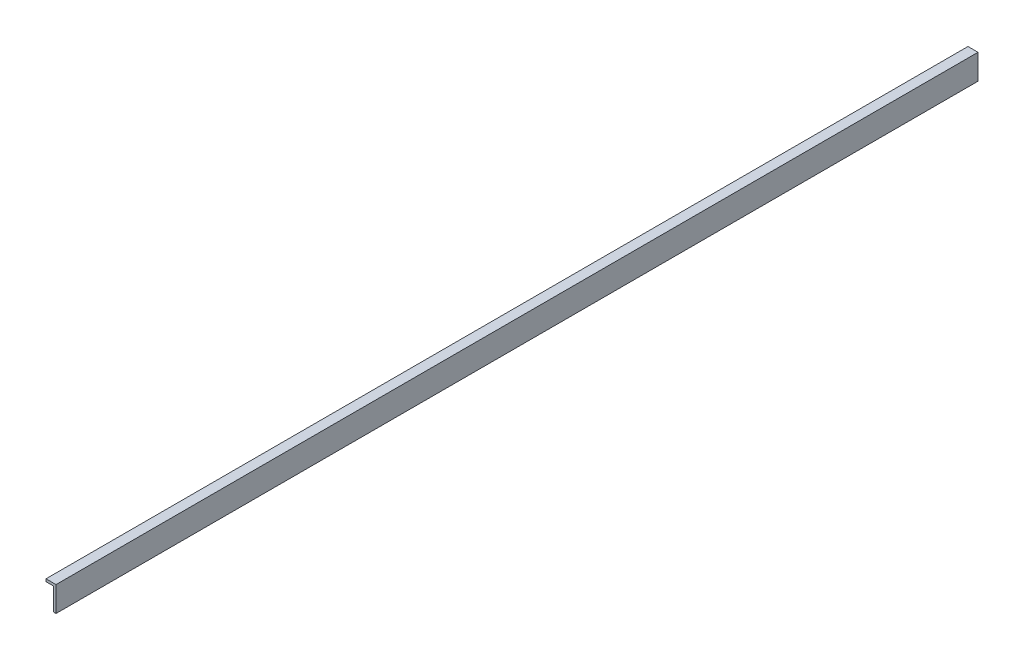
ISO-10303-21;
HEADER;
FILE_DESCRIPTION(('STEP AP214'),'2;1');
FILE_NAME('part.step','',(''),(''),'','','');
FILE_SCHEMA(('AUTOMOTIVE_DESIGN { 1 0 10303 214 1 1 1 1 }'));
ENDSEC;
DATA;
#1=APPLICATION_CONTEXT('core data for automotive mechanical design processes');
#2=APPLICATION_PROTOCOL_DEFINITION('international standard','automotive_design',2000,#1);
#3=PRODUCT_CONTEXT('',#1,'mechanical');
#4=PRODUCT('Part','Part','',(#3));
#5=PRODUCT_RELATED_PRODUCT_CATEGORY('part','',(#4));
#6=PRODUCT_DEFINITION_FORMATION('','',#4);
#7=PRODUCT_DEFINITION_CONTEXT('part definition',#1,'design');
#8=PRODUCT_DEFINITION('design','',#6,#7);
#9=PRODUCT_DEFINITION_SHAPE('','',#8);
#10=(LENGTH_UNIT() NAMED_UNIT(*) SI_UNIT(.MILLI.,.METRE.));
#11=(NAMED_UNIT(*) PLANE_ANGLE_UNIT() SI_UNIT($,.RADIAN.));
#12=(NAMED_UNIT(*) SI_UNIT($,.STERADIAN.) SOLID_ANGLE_UNIT());
#13=UNCERTAINTY_MEASURE_WITH_UNIT(LENGTH_MEASURE(1.E-05),#10,'distance_accuracy_value','');
#14=(GEOMETRIC_REPRESENTATION_CONTEXT(3) GLOBAL_UNCERTAINTY_ASSIGNED_CONTEXT((#13)) GLOBAL_UNIT_ASSIGNED_CONTEXT((#10,
#11,#12)) REPRESENTATION_CONTEXT('',''));
#15=CARTESIAN_POINT('',(0.,0.,0.));
#16=DIRECTION('',(0.,0.,1.));
#17=DIRECTION('',(1.,0.,0.));
#18=AXIS2_PLACEMENT_3D('',#15,#16,#17);
#19=CARTESIAN_POINT('',(501.5,422.5,-755.5));
#20=DIRECTION('',(-1.,0.,0.));
#21=DIRECTION('',(0.,0.,1.));
#22=AXIS2_PLACEMENT_3D('',#19,#20,#21);
#23=PLANE('',#22);
#24=DIRECTION('',(0.,-1.,0.));
#25=VECTOR('',#24,1.);
#26=CARTESIAN_POINT('',(501.5,422.5,-20.));
#27=LINE('',#26,#25);
#28=CARTESIAN_POINT('',(501.5,422.5,-20.));
#29=VERTEX_POINT('',#28);
#30=CARTESIAN_POINT('',(501.5,404.5,-20.));
#31=VERTEX_POINT('',#30);
#32=EDGE_CURVE('E124',#29,#31,#27,.T.);
#33=ORIENTED_EDGE('',*,*,#32,.F.);
#34=DIRECTION('',(0.,0.,1.));
#35=VECTOR('',#34,1.);
#36=CARTESIAN_POINT('',(501.5,422.5,-755.5));
#37=LINE('',#36,#35);
#38=CARTESIAN_POINT('',(501.5,422.5,-755.5));
#39=VERTEX_POINT('',#38);
#40=EDGE_CURVE('E11',#39,#29,#37,.T.);
#41=ORIENTED_EDGE('',*,*,#40,.F.);
#42=DIRECTION('',(0.,-1.,0.));
#43=VECTOR('',#42,1.);
#44=CARTESIAN_POINT('',(501.5,422.5,-755.5));
#45=LINE('',#44,#43);
#46=CARTESIAN_POINT('',(501.5,404.5,-755.5));
#47=VERTEX_POINT('',#46);
#48=EDGE_CURVE('E138',#39,#47,#45,.T.);
#49=ORIENTED_EDGE('',*,*,#48,.T.);
#50=DIRECTION('',(0.,0.,1.));
#51=VECTOR('',#50,1.);
#52=CARTESIAN_POINT('',(501.5,404.5,-755.5));
#53=LINE('',#52,#51);
#54=EDGE_CURVE('E42',#47,#31,#53,.T.);
#55=ORIENTED_EDGE('',*,*,#54,.T.);
#56=EDGE_LOOP('',(#33,#41,#49,#55));
#57=FACE_BOUND('',#56,.T.);
#58=ADVANCED_FACE('F39',(#57),#23,.T.);
#59=CARTESIAN_POINT('',(495.5,422.5,-755.5));
#60=DIRECTION('',(0.,-1.,0.));
#61=DIRECTION('',(0.,0.,-1.));
#62=AXIS2_PLACEMENT_3D('',#59,#60,#61);
#63=PLANE('',#62);
#64=DIRECTION('',(1.,0.,0.));
#65=VECTOR('',#64,1.);
#66=CARTESIAN_POINT('',(495.5,422.5,-20.));
#67=LINE('',#66,#65);
#68=CARTESIAN_POINT('',(495.5,422.5,-20.));
#69=VERTEX_POINT('',#68);
#70=EDGE_CURVE('E136',#69,#29,#67,.T.);
#71=ORIENTED_EDGE('',*,*,#70,.F.);
#72=DIRECTION('',(0.,0.,1.));
#73=VECTOR('',#72,1.);
#74=CARTESIAN_POINT('',(495.5,422.5,-755.5));
#75=LINE('',#74,#73);
#76=CARTESIAN_POINT('',(495.5,422.5,-755.5));
#77=VERTEX_POINT('',#76);
#78=EDGE_CURVE('E48',#77,#69,#75,.T.);
#79=ORIENTED_EDGE('',*,*,#78,.F.);
#80=DIRECTION('',(1.,0.,0.));
#81=VECTOR('',#80,1.);
#82=CARTESIAN_POINT('',(495.5,422.5,-755.5));
#83=LINE('',#82,#81);
#84=EDGE_CURVE('E114',#77,#39,#83,.T.);
#85=ORIENTED_EDGE('',*,*,#84,.T.);
#86=ORIENTED_EDGE('',*,*,#40,.T.);
#87=EDGE_LOOP('',(#71,#79,#85,#86));
#88=FACE_BOUND('',#87,.T.);
#89=ADVANCED_FACE('F146',(#88),#63,.T.);
#90=CARTESIAN_POINT('',(495.5,424.5,-755.5));
#91=DIRECTION('',(-1.,0.,0.));
#92=DIRECTION('',(0.,0.,1.));
#93=AXIS2_PLACEMENT_3D('',#90,#91,#92);
#94=PLANE('',#93);
#95=DIRECTION('',(0.,-1.,0.));
#96=VECTOR('',#95,1.);
#97=CARTESIAN_POINT('',(495.5,424.5,-20.));
#98=LINE('',#97,#96);
#99=CARTESIAN_POINT('',(495.5,424.5,-20.));
#100=VERTEX_POINT('',#99);
#101=EDGE_CURVE('E101',#100,#69,#98,.T.);
#102=ORIENTED_EDGE('',*,*,#101,.F.);
#103=DIRECTION('',(0.,0.,1.));
#104=VECTOR('',#103,1.);
#105=CARTESIAN_POINT('',(495.5,424.5,-755.5));
#106=LINE('',#105,#104);
#107=CARTESIAN_POINT('',(495.5,424.5,-755.5));
#108=VERTEX_POINT('',#107);
#109=EDGE_CURVE('E96',#108,#100,#106,.T.);
#110=ORIENTED_EDGE('',*,*,#109,.F.);
#111=DIRECTION('',(0.,-1.,0.));
#112=VECTOR('',#111,1.);
#113=CARTESIAN_POINT('',(495.5,424.5,-755.5));
#114=LINE('',#113,#112);
#115=EDGE_CURVE('E99',#108,#77,#114,.T.);
#116=ORIENTED_EDGE('',*,*,#115,.T.);
#117=ORIENTED_EDGE('',*,*,#78,.T.);
#118=EDGE_LOOP('',(#102,#110,#116,#117));
#119=FACE_BOUND('',#118,.T.);
#120=ADVANCED_FACE('F98',(#119),#94,.T.);
#121=CARTESIAN_POINT('',(503.5,424.5,-755.5));
#122=DIRECTION('',(0.,1.,0.));
#123=DIRECTION('',(0.,0.,1.));
#124=AXIS2_PLACEMENT_3D('',#121,#122,#123);
#125=PLANE('',#124);
#126=DIRECTION('',(-1.,0.,0.));
#127=VECTOR('',#126,1.);
#128=CARTESIAN_POINT('',(503.5,424.5,-20.));
#129=LINE('',#128,#127);
#130=CARTESIAN_POINT('',(503.5,424.5,-20.));
#131=VERTEX_POINT('',#130);
#132=EDGE_CURVE('E133',#131,#100,#129,.T.);
#133=ORIENTED_EDGE('',*,*,#132,.F.);
#134=DIRECTION('',(0.,0.,1.));
#135=VECTOR('',#134,1.);
#136=CARTESIAN_POINT('',(503.5,424.5,-755.5));
#137=LINE('',#136,#135);
#138=CARTESIAN_POINT('',(503.5,424.5,-755.5));
#139=VERTEX_POINT('',#138);
#140=EDGE_CURVE('E106',#139,#131,#137,.T.);
#141=ORIENTED_EDGE('',*,*,#140,.F.);
#142=DIRECTION('',(-1.,0.,0.));
#143=VECTOR('',#142,1.);
#144=CARTESIAN_POINT('',(503.5,424.5,-755.5));
#145=LINE('',#144,#143);
#146=EDGE_CURVE('E112',#139,#108,#145,.T.);
#147=ORIENTED_EDGE('',*,*,#146,.T.);
#148=ORIENTED_EDGE('',*,*,#109,.T.);
#149=EDGE_LOOP('',(#133,#141,#147,#148));
#150=FACE_BOUND('',#149,.T.);
#151=ADVANCED_FACE('F116',(#150),#125,.T.);
#152=CARTESIAN_POINT('',(503.5,404.5,-755.5));
#153=DIRECTION('',(1.,0.,0.));
#154=DIRECTION('',(0.,0.,-1.));
#155=AXIS2_PLACEMENT_3D('',#152,#153,#154);
#156=PLANE('',#155);
#157=DIRECTION('',(0.,1.,0.));
#158=VECTOR('',#157,1.);
#159=CARTESIAN_POINT('',(503.5,404.5,-20.));
#160=LINE('',#159,#158);
#161=CARTESIAN_POINT('',(503.5,404.5,-20.));
#162=VERTEX_POINT('',#161);
#163=EDGE_CURVE('E130',#162,#131,#160,.T.);
#164=ORIENTED_EDGE('',*,*,#163,.F.);
#165=DIRECTION('',(0.,0.,1.));
#166=VECTOR('',#165,1.);
#167=CARTESIAN_POINT('',(503.5,404.5,-755.5));
#168=LINE('',#167,#166);
#169=CARTESIAN_POINT('',(503.5,404.5,-755.5));
#170=VERTEX_POINT('',#169);
#171=EDGE_CURVE('E141',#170,#162,#168,.T.);
#172=ORIENTED_EDGE('',*,*,#171,.F.);
#173=DIRECTION('',(0.,1.,0.));
#174=VECTOR('',#173,1.);
#175=CARTESIAN_POINT('',(503.5,404.5,-755.5));
#176=LINE('',#175,#174);
#177=EDGE_CURVE('E117',#170,#139,#176,.T.);
#178=ORIENTED_EDGE('',*,*,#177,.T.);
#179=ORIENTED_EDGE('',*,*,#140,.T.);
#180=EDGE_LOOP('',(#164,#172,#178,#179));
#181=FACE_BOUND('',#180,.T.);
#182=ADVANCED_FACE('F159',(#181),#156,.T.);
#183=CARTESIAN_POINT('',(501.5,404.5,-755.5));
#184=DIRECTION('',(0.,-1.,0.));
#185=DIRECTION('',(0.,0.,-1.));
#186=AXIS2_PLACEMENT_3D('',#183,#184,#185);
#187=PLANE('',#186);
#188=DIRECTION('',(1.,0.,0.));
#189=VECTOR('',#188,1.);
#190=CARTESIAN_POINT('',(501.5,404.5,-20.));
#191=LINE('',#190,#189);
#192=EDGE_CURVE('E127',#31,#162,#191,.T.);
#193=ORIENTED_EDGE('',*,*,#192,.F.);
#194=ORIENTED_EDGE('',*,*,#54,.F.);
#195=DIRECTION('',(1.,0.,0.));
#196=VECTOR('',#195,1.);
#197=CARTESIAN_POINT('',(501.5,404.5,-755.5));
#198=LINE('',#197,#196);
#199=EDGE_CURVE('E119',#47,#170,#198,.T.);
#200=ORIENTED_EDGE('',*,*,#199,.T.);
#201=ORIENTED_EDGE('',*,*,#171,.T.);
#202=EDGE_LOOP('',(#193,#194,#200,#201));
#203=FACE_BOUND('',#202,.T.);
#204=ADVANCED_FACE('F143',(#203),#187,.T.);
#205=CARTESIAN_POINT('',(0.,0.,-755.5));
#206=DIRECTION('',(0.,0.,1.));
#207=DIRECTION('',(1.,0.,0.));
#208=AXIS2_PLACEMENT_3D('',#205,#206,#207);
#209=PLANE('',#208);
#210=ORIENTED_EDGE('',*,*,#48,.F.);
#211=ORIENTED_EDGE('',*,*,#84,.F.);
#212=ORIENTED_EDGE('',*,*,#115,.F.);
#213=ORIENTED_EDGE('',*,*,#146,.F.);
#214=ORIENTED_EDGE('',*,*,#177,.F.);
#215=ORIENTED_EDGE('',*,*,#199,.F.);
#216=EDGE_LOOP('',(#210,#211,#212,#213,#214,#215));
#217=FACE_BOUND('',#216,.T.);
#218=ADVANCED_FACE('F110',(#217),#209,.F.);
#219=CARTESIAN_POINT('',(0.,0.,-20.));
#220=DIRECTION('',(0.,0.,1.));
#221=DIRECTION('',(1.,0.,0.));
#222=AXIS2_PLACEMENT_3D('',#219,#220,#221);
#223=PLANE('',#222);
#224=ORIENTED_EDGE('',*,*,#32,.T.);
#225=ORIENTED_EDGE('',*,*,#192,.T.);
#226=ORIENTED_EDGE('',*,*,#163,.T.);
#227=ORIENTED_EDGE('',*,*,#132,.T.);
#228=ORIENTED_EDGE('',*,*,#101,.T.);
#229=ORIENTED_EDGE('',*,*,#70,.T.);
#230=EDGE_LOOP('',(#224,#225,#226,#227,#228,#229));
#231=FACE_BOUND('',#230,.T.);
#232=ADVANCED_FACE('F145',(#231),#223,.T.);
#233=CLOSED_SHELL('',(#58,#89,#120,#151,#182,#204,#218,#232));
#234=MANIFOLD_SOLID_BREP('B2',#233);
#235=ADVANCED_BREP_SHAPE_REPRESENTATION('',(#18,#234),#14);
#236=SHAPE_DEFINITION_REPRESENTATION(#9,#235);
ENDSEC;
END-ISO-10303-21;
